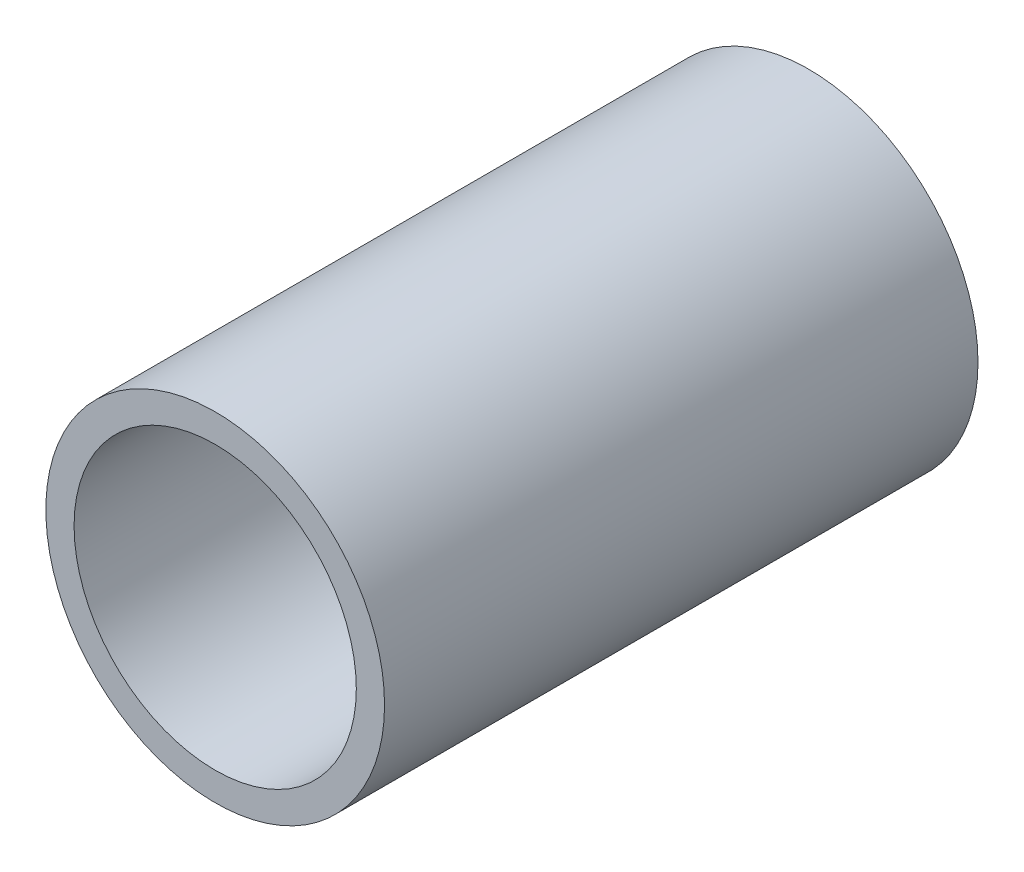
ISO-10303-21;
HEADER;
FILE_DESCRIPTION(('STEP AP214'),'2;1');
FILE_NAME('part.step','',(''),(''),'','','');
FILE_SCHEMA(('AUTOMOTIVE_DESIGN { 1 0 10303 214 1 1 1 1 }'));
ENDSEC;
DATA;
#1=APPLICATION_CONTEXT('core data for automotive mechanical design processes');
#2=APPLICATION_PROTOCOL_DEFINITION('international standard','automotive_design',2000,#1);
#3=PRODUCT_CONTEXT('',#1,'mechanical');
#4=PRODUCT('Part','Part','',(#3));
#5=PRODUCT_RELATED_PRODUCT_CATEGORY('part','',(#4));
#6=PRODUCT_DEFINITION_FORMATION('','',#4);
#7=PRODUCT_DEFINITION_CONTEXT('part definition',#1,'design');
#8=PRODUCT_DEFINITION('design','',#6,#7);
#9=PRODUCT_DEFINITION_SHAPE('','',#8);
#10=(LENGTH_UNIT() NAMED_UNIT(*) SI_UNIT(.MILLI.,.METRE.));
#11=(NAMED_UNIT(*) PLANE_ANGLE_UNIT() SI_UNIT($,.RADIAN.));
#12=(NAMED_UNIT(*) SI_UNIT($,.STERADIAN.) SOLID_ANGLE_UNIT());
#13=UNCERTAINTY_MEASURE_WITH_UNIT(LENGTH_MEASURE(1.E-05),#10,'distance_accuracy_value','');
#14=(GEOMETRIC_REPRESENTATION_CONTEXT(3) GLOBAL_UNCERTAINTY_ASSIGNED_CONTEXT((#13)) GLOBAL_UNIT_ASSIGNED_CONTEXT((#10,
#11,#12)) REPRESENTATION_CONTEXT('',''));
#15=CARTESIAN_POINT('',(0.,0.,0.));
#16=DIRECTION('',(0.,0.,1.));
#17=DIRECTION('',(1.,0.,0.));
#18=AXIS2_PLACEMENT_3D('',#15,#16,#17);
#19=CARTESIAN_POINT('',(0.,0.,-27.5));
#20=DIRECTION('',(0.,0.,1.));
#21=DIRECTION('',(1.,0.,0.));
#22=AXIS2_PLACEMENT_3D('',#19,#20,#21);
#23=CYLINDRICAL_SURFACE('',#22,7.5);
#24=CARTESIAN_POINT('',(0.,0.,-27.5));
#25=DIRECTION('',(0.,0.,1.));
#26=DIRECTION('',(1.,0.,0.));
#27=AXIS2_PLACEMENT_3D('',#24,#25,#26);
#28=CIRCLE('',#27,7.5);
#29=CARTESIAN_POINT('',(7.5,0.,-27.5));
#30=VERTEX_POINT('',#29);
#31=EDGE_CURVE('E46',#30,#30,#28,.T.);
#32=ORIENTED_EDGE('',*,*,#31,.F.);
#33=EDGE_LOOP('',(#32));
#34=FACE_BOUND('',#33,.T.);
#35=CARTESIAN_POINT('',(0.,0.,4.04));
#36=DIRECTION('',(0.,0.,1.));
#37=DIRECTION('',(1.,0.,0.));
#38=AXIS2_PLACEMENT_3D('',#35,#36,#37);
#39=CIRCLE('',#38,7.5);
#40=CARTESIAN_POINT('',(7.5,0.,4.04));
#41=VERTEX_POINT('',#40);
#42=EDGE_CURVE('E56',#41,#41,#39,.T.);
#43=ORIENTED_EDGE('',*,*,#42,.T.);
#44=EDGE_LOOP('',(#43));
#45=FACE_BOUND('',#44,.T.);
#46=ADVANCED_FACE('F39',(#34,#45),#23,.F.);
#47=CARTESIAN_POINT('',(0.,0.,-27.5));
#48=DIRECTION('',(0.,0.,1.));
#49=DIRECTION('',(1.,0.,0.));
#50=AXIS2_PLACEMENT_3D('',#47,#48,#49);
#51=CYLINDRICAL_SURFACE('',#50,9.);
#52=CARTESIAN_POINT('',(0.,0.,-27.5));
#53=DIRECTION('',(0.,0.,1.));
#54=DIRECTION('',(1.,0.,0.));
#55=AXIS2_PLACEMENT_3D('',#52,#53,#54);
#56=CIRCLE('',#55,9.);
#57=CARTESIAN_POINT('',(9.,0.,-27.5));
#58=VERTEX_POINT('',#57);
#59=EDGE_CURVE('E10',#58,#58,#56,.T.);
#60=ORIENTED_EDGE('',*,*,#59,.T.);
#61=EDGE_LOOP('',(#60));
#62=FACE_BOUND('',#61,.T.);
#63=CARTESIAN_POINT('',(0.,0.,4.04));
#64=DIRECTION('',(0.,0.,1.));
#65=DIRECTION('',(1.,0.,0.));
#66=AXIS2_PLACEMENT_3D('',#63,#64,#65);
#67=CIRCLE('',#66,9.);
#68=CARTESIAN_POINT('',(9.,0.,4.04));
#69=VERTEX_POINT('',#68);
#70=EDGE_CURVE('E51',#69,#69,#67,.T.);
#71=ORIENTED_EDGE('',*,*,#70,.F.);
#72=EDGE_LOOP('',(#71));
#73=FACE_BOUND('',#72,.T.);
#74=ADVANCED_FACE('F71',(#62,#73),#51,.T.);
#75=CARTESIAN_POINT('',(0.,0.,-27.5));
#76=DIRECTION('',(0.,0.,1.));
#77=DIRECTION('',(1.,0.,0.));
#78=AXIS2_PLACEMENT_3D('',#75,#76,#77);
#79=PLANE('',#78);
#80=ORIENTED_EDGE('',*,*,#31,.T.);
#81=EDGE_LOOP('',(#80));
#82=FACE_BOUND('',#81,.T.);
#83=ORIENTED_EDGE('',*,*,#59,.F.);
#84=EDGE_LOOP('',(#83));
#85=FACE_BOUND('',#84,.T.);
#86=ADVANCED_FACE('F67',(#82,#85),#79,.F.);
#87=CARTESIAN_POINT('',(0.,0.,4.04));
#88=DIRECTION('',(0.,0.,1.));
#89=DIRECTION('',(1.,0.,0.));
#90=AXIS2_PLACEMENT_3D('',#87,#88,#89);
#91=PLANE('',#90);
#92=ORIENTED_EDGE('',*,*,#42,.F.);
#93=EDGE_LOOP('',(#92));
#94=FACE_BOUND('',#93,.T.);
#95=ORIENTED_EDGE('',*,*,#70,.T.);
#96=EDGE_LOOP('',(#95));
#97=FACE_BOUND('',#96,.T.);
#98=ADVANCED_FACE('F64',(#94,#97),#91,.T.);
#99=CLOSED_SHELL('',(#46,#74,#86,#98));
#100=MANIFOLD_SOLID_BREP('B2',#99);
#101=ADVANCED_BREP_SHAPE_REPRESENTATION('',(#18,#100),#14);
#102=SHAPE_DEFINITION_REPRESENTATION(#9,#101);
ENDSEC;
END-ISO-10303-21;
